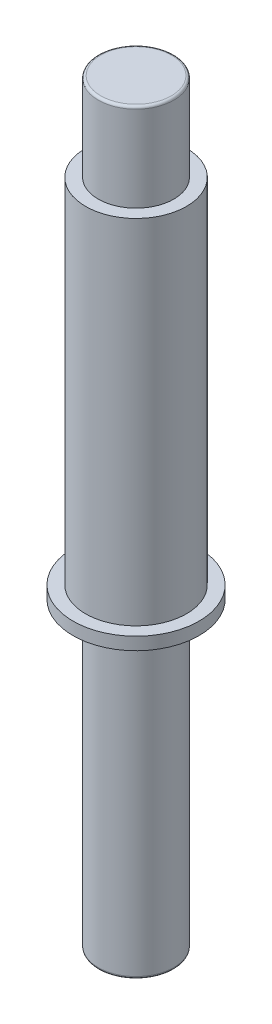
ISO-10303-21;
HEADER;
FILE_DESCRIPTION(('STEP AP214'),'2;1');
FILE_NAME('part.step','',(''),(''),'','','');
FILE_SCHEMA(('AUTOMOTIVE_DESIGN { 1 0 10303 214 1 1 1 1 }'));
ENDSEC;
DATA;
#1=APPLICATION_CONTEXT('core data for automotive mechanical design processes');
#2=APPLICATION_PROTOCOL_DEFINITION('international standard','automotive_design',2000,#1);
#3=PRODUCT_CONTEXT('',#1,'mechanical');
#4=PRODUCT('Part','Part','',(#3));
#5=PRODUCT_RELATED_PRODUCT_CATEGORY('part','',(#4));
#6=PRODUCT_DEFINITION_FORMATION('','',#4);
#7=PRODUCT_DEFINITION_CONTEXT('part definition',#1,'design');
#8=PRODUCT_DEFINITION('design','',#6,#7);
#9=PRODUCT_DEFINITION_SHAPE('','',#8);
#10=(LENGTH_UNIT() NAMED_UNIT(*) SI_UNIT(.MILLI.,.METRE.));
#11=(NAMED_UNIT(*) PLANE_ANGLE_UNIT() SI_UNIT($,.RADIAN.));
#12=(NAMED_UNIT(*) SI_UNIT($,.STERADIAN.) SOLID_ANGLE_UNIT());
#13=UNCERTAINTY_MEASURE_WITH_UNIT(LENGTH_MEASURE(1.E-05),#10,'distance_accuracy_value','');
#14=(GEOMETRIC_REPRESENTATION_CONTEXT(3) GLOBAL_UNCERTAINTY_ASSIGNED_CONTEXT((#13)) GLOBAL_UNIT_ASSIGNED_CONTEXT((#10,
#11,#12)) REPRESENTATION_CONTEXT('',''));
#15=CARTESIAN_POINT('',(0.,0.,0.));
#16=DIRECTION('',(0.,0.,1.));
#17=DIRECTION('',(1.,0.,0.));
#18=AXIS2_PLACEMENT_3D('',#15,#16,#17);
#19=CARTESIAN_POINT('',(0.,26.5,0.));
#20=DIRECTION('',(0.,-1.,0.));
#21=DIRECTION('',(0.,0.,-1.));
#22=AXIS2_PLACEMENT_3D('',#19,#20,#21);
#23=CYLINDRICAL_SURFACE('',#22,2.);
#24=CARTESIAN_POINT('',(0.,26.5,0.));
#25=DIRECTION('',(0.,1.,0.));
#26=DIRECTION('',(0.,0.,1.));
#27=AXIS2_PLACEMENT_3D('',#24,#25,#26);
#28=CIRCLE('',#27,2.);
#29=CARTESIAN_POINT('',(0.,26.5,-2.));
#30=VERTEX_POINT('',#29);
#31=EDGE_CURVE('E59',#30,#30,#28,.T.);
#32=CARTESIAN_POINT('',(0.,12.5,0.));
#33=DIRECTION('',(0.,-1.,0.));
#34=DIRECTION('',(0.,0.,-1.));
#35=AXIS2_PLACEMENT_3D('',#32,#33,#34);
#36=CIRCLE('',#35,2.);
#37=CARTESIAN_POINT('',(0.,12.5,-2.));
#38=VERTEX_POINT('',#37);
#39=EDGE_CURVE('E10',#38,#38,#36,.T.);
#40=CARTESIAN_POINT('',(0.,26.5,-2.));
#41=CARTESIAN_POINT('',(0.,26.3541666666667,-2.));
#42=CARTESIAN_POINT('',(0.,26.2083333333333,-2.));
#43=CARTESIAN_POINT('',(0.,25.9166666666667,-2.));
#44=CARTESIAN_POINT('',(0.,25.7708333333333,-2.));
#45=CARTESIAN_POINT('',(0.,25.4791666666667,-2.));
#46=CARTESIAN_POINT('',(0.,25.3333333333333,-2.));
#47=CARTESIAN_POINT('',(0.,25.0416666666667,-2.));
#48=CARTESIAN_POINT('',(0.,24.8958333333333,-2.));
#49=CARTESIAN_POINT('',(0.,24.6041666666667,-2.));
#50=CARTESIAN_POINT('',(0.,24.4583333333333,-2.));
#51=CARTESIAN_POINT('',(0.,24.1666666666667,-2.));
#52=CARTESIAN_POINT('',(0.,24.0208333333333,-2.));
#53=CARTESIAN_POINT('',(0.,23.7291666666667,-2.));
#54=CARTESIAN_POINT('',(0.,23.5833333333333,-2.));
#55=CARTESIAN_POINT('',(0.,23.2916666666667,-2.));
#56=CARTESIAN_POINT('',(0.,23.1458333333333,-2.));
#57=CARTESIAN_POINT('',(0.,22.8541666666667,-2.));
#58=CARTESIAN_POINT('',(0.,22.7083333333333,-2.));
#59=CARTESIAN_POINT('',(0.,22.4166666666667,-2.));
#60=CARTESIAN_POINT('',(0.,22.2708333333333,-2.));
#61=CARTESIAN_POINT('',(0.,21.9791666666667,-2.));
#62=CARTESIAN_POINT('',(0.,21.8333333333333,-2.));
#63=CARTESIAN_POINT('',(0.,21.5416666666667,-2.));
#64=CARTESIAN_POINT('',(0.,21.3958333333333,-2.));
#65=CARTESIAN_POINT('',(0.,21.1041666666667,-2.));
#66=CARTESIAN_POINT('',(0.,20.9583333333333,-2.));
#67=CARTESIAN_POINT('',(0.,20.6666666666667,-2.));
#68=CARTESIAN_POINT('',(0.,20.5208333333333,-2.));
#69=CARTESIAN_POINT('',(0.,20.2291666666667,-2.));
#70=CARTESIAN_POINT('',(0.,20.0833333333333,-2.));
#71=CARTESIAN_POINT('',(0.,19.7916666666667,-2.));
#72=CARTESIAN_POINT('',(0.,19.6458333333333,-2.));
#73=CARTESIAN_POINT('',(0.,19.3541666666667,-2.));
#74=CARTESIAN_POINT('',(0.,19.2083333333333,-2.));
#75=CARTESIAN_POINT('',(0.,18.9166666666667,-2.));
#76=CARTESIAN_POINT('',(0.,18.7708333333333,-2.));
#77=CARTESIAN_POINT('',(0.,18.4791666666667,-2.));
#78=CARTESIAN_POINT('',(0.,18.3333333333333,-2.));
#79=CARTESIAN_POINT('',(0.,18.0416666666667,-2.));
#80=CARTESIAN_POINT('',(0.,17.8958333333333,-2.));
#81=CARTESIAN_POINT('',(0.,17.6041666666667,-2.));
#82=CARTESIAN_POINT('',(0.,17.4583333333333,-2.));
#83=CARTESIAN_POINT('',(0.,17.1666666666667,-2.));
#84=CARTESIAN_POINT('',(0.,17.0208333333333,-2.));
#85=CARTESIAN_POINT('',(0.,16.7291666666667,-2.));
#86=CARTESIAN_POINT('',(0.,16.5833333333333,-2.));
#87=CARTESIAN_POINT('',(0.,16.2916666666667,-2.));
#88=CARTESIAN_POINT('',(0.,16.1458333333333,-2.));
#89=CARTESIAN_POINT('',(0.,15.8541666666667,-2.));
#90=CARTESIAN_POINT('',(0.,15.7083333333333,-2.));
#91=CARTESIAN_POINT('',(0.,15.4166666666667,-2.));
#92=CARTESIAN_POINT('',(0.,15.2708333333333,-2.));
#93=CARTESIAN_POINT('',(0.,14.9791666666667,-2.));
#94=CARTESIAN_POINT('',(0.,14.8333333333333,-2.));
#95=CARTESIAN_POINT('',(0.,14.5416666666667,-2.));
#96=CARTESIAN_POINT('',(0.,14.3958333333333,-2.));
#97=CARTESIAN_POINT('',(0.,14.1041666666667,-2.));
#98=CARTESIAN_POINT('',(0.,13.9583333333333,-2.));
#99=CARTESIAN_POINT('',(0.,13.6666666666667,-2.));
#100=CARTESIAN_POINT('',(0.,13.5208333333333,-2.));
#101=CARTESIAN_POINT('',(0.,13.2291666666667,-2.));
#102=CARTESIAN_POINT('',(0.,13.0833333333333,-2.));
#103=CARTESIAN_POINT('',(0.,12.7916666666667,-2.));
#104=CARTESIAN_POINT('',(0.,12.6458333333333,-2.));
#105=CARTESIAN_POINT('',(0.,12.5,-2.));
#106=B_SPLINE_CURVE_WITH_KNOTS('',3,(#40,#41,#42,#43,#44,#45,#46,#47,#48,#49,#50,#51,#52,#53,
#54,#55,#56,#57,#58,#59,#60,#61,#62,#63,#64,#65,#66,#67,#68,#69,#70,#71,#72,#73,#74,#75,#76,#77,
#78,#79,#80,#81,#82,#83,#84,#85,#86,#87,#88,#89,#90,#91,#92,#93,#94,#95,#96,#97,#98,#99,#100,
#101,#102,#103,#104,#105),.UNSPECIFIED.,.F.,.F.,(4,2,2,2,2,2,2,2,2,2,2,2,2,2,2,2,2,2,2,2,2,2,2,
2,2,2,2,2,2,2,2,2,4),(0.,0.437499999999997,0.874999999999997,1.3125,1.75,2.1875,2.625,3.0625,
3.5,3.9375,4.375,4.8125,5.25,5.6875,6.125,6.5625,7.,7.4375,7.875,8.3125,8.75,9.1875,9.625,
10.0625,10.5,10.9375,11.375,11.8125,12.25,12.6875,13.125,13.5625,14.),.UNSPECIFIED.);
#107=EDGE_CURVE('BSEAM33',#30,#38,#106,.T.);
#108=ORIENTED_EDGE('',*,*,#31,.F.);
#109=ORIENTED_EDGE('',*,*,#39,.F.);
#110=ORIENTED_EDGE('',*,*,#107,.T.);
#111=ORIENTED_EDGE('',*,*,#107,.F.);
#112=EDGE_LOOP('',(#108,#110,#109,#111));
#113=FACE_BOUND('',#112,.T.);
#114=ADVANCED_FACE('F33',(#113),#23,.T.);
#115=CARTESIAN_POINT('',(0.,30.,0.));
#116=DIRECTION('',(0.,-1.,0.));
#117=DIRECTION('',(0.,0.,-1.));
#118=AXIS2_PLACEMENT_3D('',#115,#116,#117);
#119=CYLINDRICAL_SURFACE('',#118,1.5);
#120=CARTESIAN_POINT('',(0.,29.9,0.));
#121=DIRECTION('',(0.,1.,0.));
#122=DIRECTION('',(0.,0.,1.));
#123=AXIS2_PLACEMENT_3D('',#120,#121,#122);
#124=CIRCLE('',#123,1.5);
#125=CARTESIAN_POINT('',(0.,29.9,1.5));
#126=VERTEX_POINT('',#125);
#127=EDGE_CURVE('E48',#126,#126,#124,.F.);
#128=ORIENTED_EDGE('',*,*,#127,.T.);
#129=EDGE_LOOP('',(#128));
#130=FACE_BOUND('',#129,.T.);
#131=CARTESIAN_POINT('',(0.,26.5,0.));
#132=DIRECTION('',(0.,1.,0.));
#133=DIRECTION('',(0.,0.,1.));
#134=AXIS2_PLACEMENT_3D('',#131,#132,#133);
#135=CIRCLE('',#134,1.5);
#136=CARTESIAN_POINT('',(0.,26.5,1.5));
#137=VERTEX_POINT('',#136);
#138=EDGE_CURVE('E62',#137,#137,#135,.T.);
#139=ORIENTED_EDGE('',*,*,#138,.T.);
#140=EDGE_LOOP('',(#139));
#141=FACE_BOUND('',#140,.T.);
#142=ADVANCED_FACE('F88',(#130,#141),#119,.T.);
#143=CARTESIAN_POINT('',(0.,30.,0.));
#144=DIRECTION('',(0.,1.,0.));
#145=DIRECTION('',(0.,0.,1.));
#146=AXIS2_PLACEMENT_3D('',#143,#144,#145);
#147=PLANE('',#146);
#148=CARTESIAN_POINT('',(0.,30.,0.));
#149=DIRECTION('',(0.,1.,0.));
#150=DIRECTION('',(0.,0.,1.));
#151=AXIS2_PLACEMENT_3D('',#148,#149,#150);
#152=CIRCLE('',#151,1.4);
#153=CARTESIAN_POINT('',(0.,30.,1.4));
#154=VERTEX_POINT('',#153);
#155=EDGE_CURVE('E53',#154,#154,#152,.T.);
#156=ORIENTED_EDGE('',*,*,#155,.T.);
#157=EDGE_LOOP('',(#156));
#158=FACE_BOUND('',#157,.T.);
#159=ADVANCED_FACE('F96',(#158),#147,.T.);
#160=CARTESIAN_POINT('',(0.,26.5,0.));
#161=DIRECTION('',(0.,1.,0.));
#162=DIRECTION('',(0.,0.,1.));
#163=AXIS2_PLACEMENT_3D('',#160,#161,#162);
#164=PLANE('',#163);
#165=ORIENTED_EDGE('',*,*,#31,.T.);
#166=EDGE_LOOP('',(#165));
#167=FACE_BOUND('',#166,.T.);
#168=ORIENTED_EDGE('',*,*,#138,.F.);
#169=EDGE_LOOP('',(#168));
#170=FACE_BOUND('',#169,.T.);
#171=ADVANCED_FACE('F107',(#167,#170),#164,.T.);
#172=CARTESIAN_POINT('',(0.,29.9,0.));
#173=DIRECTION('',(0.,1.,0.));
#174=DIRECTION('',(0.,0.,1.));
#175=AXIS2_PLACEMENT_3D('',#172,#173,#174);
#176=TOROIDAL_SURFACE('',#175,1.4,0.1);
#177=ORIENTED_EDGE('',*,*,#127,.F.);
#178=EDGE_LOOP('',(#177));
#179=FACE_BOUND('',#178,.T.);
#180=ORIENTED_EDGE('',*,*,#155,.F.);
#181=EDGE_LOOP('',(#180));
#182=FACE_BOUND('',#181,.T.);
#183=ADVANCED_FACE('F85',(#179,#182),#176,.T.);
#184=CARTESIAN_POINT('',(0.,12.5,0.));
#185=DIRECTION('',(0.,-1.,0.));
#186=DIRECTION('',(0.,0.,-1.));
#187=AXIS2_PLACEMENT_3D('',#184,#185,#186);
#188=CYLINDRICAL_SURFACE('',#187,2.5);
#189=CARTESIAN_POINT('',(0.,12.5,0.));
#190=DIRECTION('',(0.,-1.,0.));
#191=DIRECTION('',(0.,0.,-1.));
#192=AXIS2_PLACEMENT_3D('',#189,#190,#191);
#193=CIRCLE('',#192,2.5);
#194=CARTESIAN_POINT('',(0.,12.5,-2.5));
#195=VERTEX_POINT('',#194);
#196=EDGE_CURVE('E65',#195,#195,#193,.T.);
#197=ORIENTED_EDGE('',*,*,#196,.T.);
#198=EDGE_LOOP('',(#197));
#199=FACE_BOUND('',#198,.T.);
#200=CARTESIAN_POINT('',(0.,12.,0.));
#201=DIRECTION('',(0.,-1.,0.));
#202=DIRECTION('',(0.,0.,-1.));
#203=AXIS2_PLACEMENT_3D('',#200,#201,#202);
#204=CIRCLE('',#203,2.5);
#205=CARTESIAN_POINT('',(0.,12.,-2.5));
#206=VERTEX_POINT('',#205);
#207=EDGE_CURVE('E66',#206,#206,#204,.T.);
#208=ORIENTED_EDGE('',*,*,#207,.F.);
#209=EDGE_LOOP('',(#208));
#210=FACE_BOUND('',#209,.T.);
#211=ADVANCED_FACE('F72',(#199,#210),#188,.T.);
#212=CARTESIAN_POINT('',(0.,12.5,0.));
#213=DIRECTION('',(0.,-1.,0.));
#214=DIRECTION('',(0.,0.,-1.));
#215=AXIS2_PLACEMENT_3D('',#212,#213,#214);
#216=PLANE('',#215);
#217=ORIENTED_EDGE('',*,*,#39,.T.);
#218=EDGE_LOOP('',(#217));
#219=FACE_BOUND('',#218,.T.);
#220=ORIENTED_EDGE('',*,*,#196,.F.);
#221=EDGE_LOOP('',(#220));
#222=FACE_BOUND('',#221,.T.);
#223=ADVANCED_FACE('F75',(#219,#222),#216,.F.);
#224=CARTESIAN_POINT('',(0.,0.,0.));
#225=DIRECTION('',(0.,1.,0.));
#226=DIRECTION('',(0.,0.,1.));
#227=AXIS2_PLACEMENT_3D('',#224,#225,#226);
#228=PLANE('',#227);
#229=CARTESIAN_POINT('',(0.,0.,0.));
#230=DIRECTION('',(0.,1.,0.));
#231=DIRECTION('',(0.,0.,1.));
#232=AXIS2_PLACEMENT_3D('',#229,#230,#231);
#233=CIRCLE('',#232,1.4);
#234=CARTESIAN_POINT('',(0.,0.,1.4));
#235=VERTEX_POINT('',#234);
#236=EDGE_CURVE('E40',#235,#235,#233,.F.);
#237=ORIENTED_EDGE('',*,*,#236,.T.);
#238=EDGE_LOOP('',(#237));
#239=FACE_BOUND('',#238,.T.);
#240=ADVANCED_FACE('F77',(#239),#228,.F.);
#241=CARTESIAN_POINT('',(0.,0.0999999999999994,0.));
#242=DIRECTION('',(0.,1.,0.));
#243=DIRECTION('',(0.,0.,1.));
#244=AXIS2_PLACEMENT_3D('',#241,#242,#243);
#245=TOROIDAL_SURFACE('',#244,1.4,0.1);
#246=ORIENTED_EDGE('',*,*,#236,.F.);
#247=EDGE_LOOP('',(#246));
#248=FACE_BOUND('',#247,.T.);
#249=CARTESIAN_POINT('',(0.,0.0999999999999994,0.));
#250=DIRECTION('',(0.,1.,0.));
#251=DIRECTION('',(0.,0.,1.));
#252=AXIS2_PLACEMENT_3D('',#249,#250,#251);
#253=CIRCLE('',#252,1.5);
#254=CARTESIAN_POINT('',(0.,0.0999999999999994,1.5));
#255=VERTEX_POINT('',#254);
#256=EDGE_CURVE('E44',#255,#255,#253,.T.);
#257=ORIENTED_EDGE('',*,*,#256,.F.);
#258=EDGE_LOOP('',(#257));
#259=FACE_BOUND('',#258,.T.);
#260=ADVANCED_FACE('F35',(#248,#259),#245,.T.);
#261=ORIENTED_EDGE('',*,*,#256,.T.);
#262=EDGE_LOOP('',(#261));
#263=FACE_BOUND('',#262,.T.);
#264=CARTESIAN_POINT('',(0.,12.,0.));
#265=DIRECTION('',(0.,1.,0.));
#266=DIRECTION('',(0.,0.,1.));
#267=AXIS2_PLACEMENT_3D('',#264,#265,#266);
#268=CIRCLE('',#267,1.5);
#269=CARTESIAN_POINT('',(0.,12.,1.5));
#270=VERTEX_POINT('',#269);
#271=EDGE_CURVE('E56',#270,#270,#268,.T.);
#272=ORIENTED_EDGE('',*,*,#271,.F.);
#273=EDGE_LOOP('',(#272));
#274=FACE_BOUND('',#273,.T.);
#275=ADVANCED_FACE('F99',(#263,#274),#119,.T.);
#276=CARTESIAN_POINT('',(0.,12.,0.));
#277=DIRECTION('',(0.,1.,0.));
#278=DIRECTION('',(0.,0.,1.));
#279=AXIS2_PLACEMENT_3D('',#276,#277,#278);
#280=PLANE('',#279);
#281=ORIENTED_EDGE('',*,*,#271,.T.);
#282=EDGE_LOOP('',(#281));
#283=FACE_BOUND('',#282,.T.);
#284=ORIENTED_EDGE('',*,*,#207,.T.);
#285=EDGE_LOOP('',(#284));
#286=FACE_BOUND('',#285,.T.);
#287=ADVANCED_FACE('F104',(#283,#286),#280,.F.);
#288=CLOSED_SHELL('',(#114,#142,#159,#171,#183,#211,#223,#240,#260,#275,#287));
#289=MANIFOLD_SOLID_BREP('B2',#288);
#290=ADVANCED_BREP_SHAPE_REPRESENTATION('',(#18,#289),#14);
#291=SHAPE_DEFINITION_REPRESENTATION(#9,#290);
ENDSEC;
END-ISO-10303-21;
